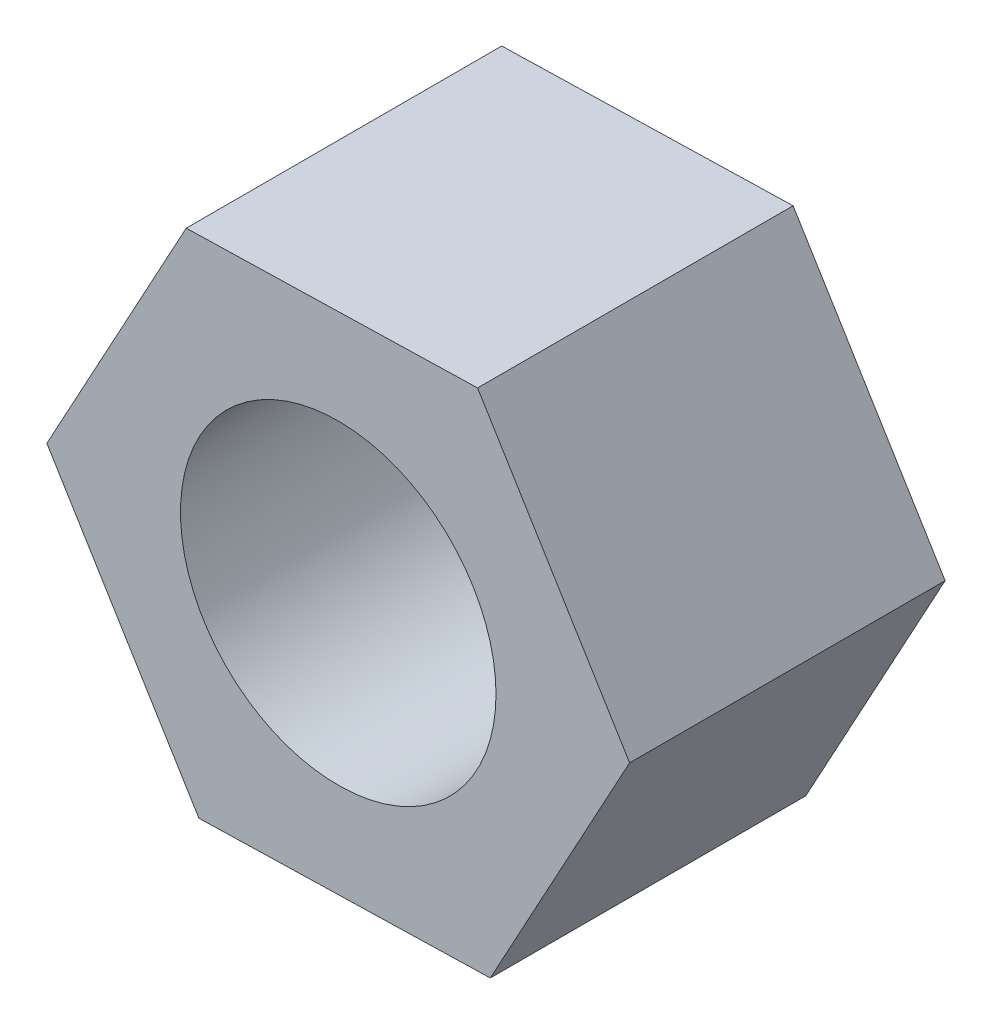
ISO-10303-21;
HEADER;
FILE_DESCRIPTION(('STEP AP214'),'2;1');
FILE_NAME('part.step','',(''),(''),'','','');
FILE_SCHEMA(('AUTOMOTIVE_DESIGN { 1 0 10303 214 1 1 1 1 }'));
ENDSEC;
DATA;
#1=APPLICATION_CONTEXT('core data for automotive mechanical design processes');
#2=APPLICATION_PROTOCOL_DEFINITION('international standard','automotive_design',2000,#1);
#3=PRODUCT_CONTEXT('',#1,'mechanical');
#4=PRODUCT('Part','Part','',(#3));
#5=PRODUCT_RELATED_PRODUCT_CATEGORY('part','',(#4));
#6=PRODUCT_DEFINITION_FORMATION('','',#4);
#7=PRODUCT_DEFINITION_CONTEXT('part definition',#1,'design');
#8=PRODUCT_DEFINITION('design','',#6,#7);
#9=PRODUCT_DEFINITION_SHAPE('','',#8);
#10=(LENGTH_UNIT() NAMED_UNIT(*) SI_UNIT(.MILLI.,.METRE.));
#11=(NAMED_UNIT(*) PLANE_ANGLE_UNIT() SI_UNIT($,.RADIAN.));
#12=(NAMED_UNIT(*) SI_UNIT($,.STERADIAN.) SOLID_ANGLE_UNIT());
#13=UNCERTAINTY_MEASURE_WITH_UNIT(LENGTH_MEASURE(1.E-05),#10,'distance_accuracy_value','');
#14=(GEOMETRIC_REPRESENTATION_CONTEXT(3) GLOBAL_UNCERTAINTY_ASSIGNED_CONTEXT((#13)) GLOBAL_UNIT_ASSIGNED_CONTEXT((#10,
#11,#12)) REPRESENTATION_CONTEXT('',''));
#15=CARTESIAN_POINT('',(0.,0.,0.));
#16=DIRECTION('',(0.,0.,1.));
#17=DIRECTION('',(1.,0.,0.));
#18=AXIS2_PLACEMENT_3D('',#15,#16,#17);
#19=CARTESIAN_POINT('',(4.61734472683495,0.116021579470562,5.));
#20=DIRECTION('',(-0.853192431880465,-0.521596275084378,0.));
#21=DIRECTION('',(0.521596275084378,-0.853192431880465,0.));
#22=AXIS2_PLACEMENT_3D('',#19,#20,#21);
#23=PLANE('',#22);
#24=DIRECTION('',(-0.521596275084378,0.853192431880465,0.));
#25=VECTOR('',#24,1.);
#26=CARTESIAN_POINT('',(4.61734472683495,0.116021579470562,0.));
#27=LINE('',#26,#25);
#28=CARTESIAN_POINT('',(4.61734472683495,0.116021579470562,0.));
#29=VERTEX_POINT('',#28);
#30=CARTESIAN_POINT('',(2.20819472820877,4.05674862120447,0.));
#31=VERTEX_POINT('',#30);
#32=EDGE_CURVE('E124',#29,#31,#27,.T.);
#33=ORIENTED_EDGE('',*,*,#32,.T.);
#34=DIRECTION('',(0.,0.,-1.));
#35=VECTOR('',#34,1.);
#36=CARTESIAN_POINT('',(2.20819472820877,4.05674862120447,5.));
#37=LINE('',#36,#35);
#38=CARTESIAN_POINT('',(2.20819472820877,4.05674862120447,5.));
#39=VERTEX_POINT('',#38);
#40=EDGE_CURVE('E11',#39,#31,#37,.T.);
#41=ORIENTED_EDGE('',*,*,#40,.F.);
#42=DIRECTION('',(-0.521596275084378,0.853192431880465,0.));
#43=VECTOR('',#42,1.);
#44=CARTESIAN_POINT('',(4.61734472683495,0.116021579470562,5.));
#45=LINE('',#44,#43);
#46=CARTESIAN_POINT('',(4.61734472683495,0.116021579470562,5.));
#47=VERTEX_POINT('',#46);
#48=EDGE_CURVE('E135',#47,#39,#45,.T.);
#49=ORIENTED_EDGE('',*,*,#48,.F.);
#50=DIRECTION('',(0.,0.,-1.));
#51=VECTOR('',#50,1.);
#52=CARTESIAN_POINT('',(4.61734472683495,0.116021579470562,5.));
#53=LINE('',#52,#51);
#54=EDGE_CURVE('E120',#47,#29,#53,.T.);
#55=ORIENTED_EDGE('',*,*,#54,.T.);
#56=EDGE_LOOP('',(#33,#41,#49,#55));
#57=FACE_BOUND('',#56,.T.);
#58=ADVANCED_FACE('F39',(#57),#23,.F.);
#59=CARTESIAN_POINT('',(2.20819472820877,4.05674862120447,5.));
#60=DIRECTION('',(0.0251194088021756,-0.999684457867296,0.));
#61=DIRECTION('',(0.999684457867296,0.0251194088021756,0.));
#62=AXIS2_PLACEMENT_3D('',#59,#60,#61);
#63=PLANE('',#62);
#64=DIRECTION('',(-0.999684457867296,-0.0251194088021756,0.));
#65=VECTOR('',#64,1.);
#66=CARTESIAN_POINT('',(2.20819472820877,4.05674862120447,0.));
#67=LINE('',#66,#65);
#68=CARTESIAN_POINT('',(-2.40914999862618,3.9407270417339,0.));
#69=VERTEX_POINT('',#68);
#70=EDGE_CURVE('E127',#31,#69,#67,.T.);
#71=ORIENTED_EDGE('',*,*,#70,.T.);
#72=DIRECTION('',(0.,0.,-1.));
#73=VECTOR('',#72,1.);
#74=CARTESIAN_POINT('',(-2.40914999862618,3.9407270417339,5.));
#75=LINE('',#74,#73);
#76=CARTESIAN_POINT('',(-2.40914999862618,3.9407270417339,5.));
#77=VERTEX_POINT('',#76);
#78=EDGE_CURVE('E48',#77,#69,#75,.T.);
#79=ORIENTED_EDGE('',*,*,#78,.F.);
#80=DIRECTION('',(-0.999684457867296,-0.0251194088021756,0.));
#81=VECTOR('',#80,1.);
#82=CARTESIAN_POINT('',(2.20819472820877,4.05674862120447,5.));
#83=LINE('',#82,#81);
#84=EDGE_CURVE('E93',#39,#77,#83,.T.);
#85=ORIENTED_EDGE('',*,*,#84,.F.);
#86=ORIENTED_EDGE('',*,*,#40,.T.);
#87=EDGE_LOOP('',(#71,#79,#85,#86));
#88=FACE_BOUND('',#87,.T.);
#89=ADVANCED_FACE('F161',(#88),#63,.F.);
#90=CARTESIAN_POINT('',(-2.40914999862618,3.9407270417339,5.));
#91=DIRECTION('',(0.87831184068264,-0.478088182782918,0.));
#92=DIRECTION('',(0.478088182782918,0.87831184068264,0.));
#93=AXIS2_PLACEMENT_3D('',#90,#91,#92);
#94=PLANE('',#93);
#95=DIRECTION('',(-0.478088182782918,-0.87831184068264,0.));
#96=VECTOR('',#95,1.);
#97=CARTESIAN_POINT('',(-2.40914999862618,3.9407270417339,0.));
#98=LINE('',#97,#96);
#99=CARTESIAN_POINT('',(-4.61734472683495,-0.116021579470562,0.));
#100=VERTEX_POINT('',#99);
#101=EDGE_CURVE('E130',#69,#100,#98,.T.);
#102=ORIENTED_EDGE('',*,*,#101,.T.);
#103=DIRECTION('',(0.,0.,-1.));
#104=VECTOR('',#103,1.);
#105=CARTESIAN_POINT('',(-4.61734472683495,-0.116021579470562,5.));
#106=LINE('',#105,#104);
#107=CARTESIAN_POINT('',(-4.61734472683495,-0.116021579470562,5.));
#108=VERTEX_POINT('',#107);
#109=EDGE_CURVE('E115',#108,#100,#106,.T.);
#110=ORIENTED_EDGE('',*,*,#109,.F.);
#111=DIRECTION('',(-0.478088182782918,-0.87831184068264,0.));
#112=VECTOR('',#111,1.);
#113=CARTESIAN_POINT('',(-2.40914999862618,3.9407270417339,5.));
#114=LINE('',#113,#112);
#115=EDGE_CURVE('E106',#77,#108,#114,.T.);
#116=ORIENTED_EDGE('',*,*,#115,.F.);
#117=ORIENTED_EDGE('',*,*,#78,.T.);
#118=EDGE_LOOP('',(#102,#110,#116,#117));
#119=FACE_BOUND('',#118,.T.);
#120=ADVANCED_FACE('F142',(#119),#94,.F.);
#121=CARTESIAN_POINT('',(-4.61734472683495,-0.116021579470562,5.));
#122=DIRECTION('',(0.853192431880465,0.521596275084379,0.));
#123=DIRECTION('',(-0.521596275084379,0.853192431880465,0.));
#124=AXIS2_PLACEMENT_3D('',#121,#122,#123);
#125=PLANE('',#124);
#126=DIRECTION('',(0.521596275084379,-0.853192431880464,0.));
#127=VECTOR('',#126,1.);
#128=CARTESIAN_POINT('',(-4.61734472683495,-0.116021579470562,0.));
#129=LINE('',#128,#127);
#130=CARTESIAN_POINT('',(-2.20819472820877,-4.05674862120446,0.));
#131=VERTEX_POINT('',#130);
#132=EDGE_CURVE('E114',#100,#131,#129,.T.);
#133=ORIENTED_EDGE('',*,*,#132,.T.);
#134=DIRECTION('',(0.,0.,-1.));
#135=VECTOR('',#134,1.);
#136=CARTESIAN_POINT('',(-2.20819472820877,-4.05674862120446,5.));
#137=LINE('',#136,#135);
#138=CARTESIAN_POINT('',(-2.20819472820877,-4.05674862120446,5.));
#139=VERTEX_POINT('',#138);
#140=EDGE_CURVE('E111',#139,#131,#137,.T.);
#141=ORIENTED_EDGE('',*,*,#140,.F.);
#142=DIRECTION('',(0.521596275084379,-0.853192431880464,0.));
#143=VECTOR('',#142,1.);
#144=CARTESIAN_POINT('',(-4.61734472683495,-0.116021579470562,5.));
#145=LINE('',#144,#143);
#146=EDGE_CURVE('E100',#108,#139,#145,.T.);
#147=ORIENTED_EDGE('',*,*,#146,.F.);
#148=ORIENTED_EDGE('',*,*,#109,.T.);
#149=EDGE_LOOP('',(#133,#141,#147,#148));
#150=FACE_BOUND('',#149,.T.);
#151=ADVANCED_FACE('F112',(#150),#125,.F.);
#152=CARTESIAN_POINT('',(-2.20819472820877,-4.05674862120446,5.));
#153=DIRECTION('',(-0.025119408802175,0.999684457867296,0.));
#154=DIRECTION('',(-0.999684457867296,-0.025119408802175,0.));
#155=AXIS2_PLACEMENT_3D('',#152,#153,#154);
#156=PLANE('',#155);
#157=DIRECTION('',(0.999684457867296,0.025119408802175,0.));
#158=VECTOR('',#157,1.);
#159=CARTESIAN_POINT('',(-2.20819472820877,-4.05674862120446,0.));
#160=LINE('',#159,#158);
#161=CARTESIAN_POINT('',(2.40914999862618,-3.9407270417339,0.));
#162=VERTEX_POINT('',#161);
#163=EDGE_CURVE('E79',#131,#162,#160,.T.);
#164=ORIENTED_EDGE('',*,*,#163,.T.);
#165=DIRECTION('',(0.,0.,-1.));
#166=VECTOR('',#165,1.);
#167=CARTESIAN_POINT('',(2.40914999862618,-3.9407270417339,5.));
#168=LINE('',#167,#166);
#169=CARTESIAN_POINT('',(2.40914999862618,-3.9407270417339,5.));
#170=VERTEX_POINT('',#169);
#171=EDGE_CURVE('E116',#170,#162,#168,.T.);
#172=ORIENTED_EDGE('',*,*,#171,.F.);
#173=DIRECTION('',(0.999684457867296,0.025119408802175,0.));
#174=VECTOR('',#173,1.);
#175=CARTESIAN_POINT('',(-2.20819472820877,-4.05674862120446,5.));
#176=LINE('',#175,#174);
#177=EDGE_CURVE('E104',#139,#170,#176,.T.);
#178=ORIENTED_EDGE('',*,*,#177,.F.);
#179=ORIENTED_EDGE('',*,*,#140,.T.);
#180=EDGE_LOOP('',(#164,#172,#178,#179));
#181=FACE_BOUND('',#180,.T.);
#182=ADVANCED_FACE('F118',(#181),#156,.F.);
#183=CARTESIAN_POINT('',(2.40914999862618,-3.9407270417339,5.));
#184=DIRECTION('',(-0.878311840682641,0.478088182782917,0.));
#185=DIRECTION('',(-0.478088182782917,-0.878311840682641,0.));
#186=AXIS2_PLACEMENT_3D('',#183,#184,#185);
#187=PLANE('',#186);
#188=DIRECTION('',(0.478088182782917,0.878311840682641,0.));
#189=VECTOR('',#188,1.);
#190=CARTESIAN_POINT('',(2.40914999862618,-3.9407270417339,0.));
#191=LINE('',#190,#189);
#192=EDGE_CURVE('E85',#162,#29,#191,.T.);
#193=ORIENTED_EDGE('',*,*,#192,.T.);
#194=ORIENTED_EDGE('',*,*,#54,.F.);
#195=DIRECTION('',(0.478088182782917,0.878311840682641,0.));
#196=VECTOR('',#195,1.);
#197=CARTESIAN_POINT('',(2.40914999862618,-3.9407270417339,5.));
#198=LINE('',#197,#196);
#199=EDGE_CURVE('E56',#170,#47,#198,.T.);
#200=ORIENTED_EDGE('',*,*,#199,.F.);
#201=ORIENTED_EDGE('',*,*,#171,.T.);
#202=EDGE_LOOP('',(#193,#194,#200,#201));
#203=FACE_BOUND('',#202,.T.);
#204=ADVANCED_FACE('F149',(#203),#187,.F.);
#205=CARTESIAN_POINT('',(0.,0.,5.));
#206=DIRECTION('',(0.,0.,1.));
#207=DIRECTION('',(1.,0.,0.));
#208=AXIS2_PLACEMENT_3D('',#205,#206,#207);
#209=PLANE('',#208);
#210=CARTESIAN_POINT('',(0.,0.,5.));
#211=DIRECTION('',(0.,0.,1.));
#212=DIRECTION('',(1.,0.,0.));
#213=AXIS2_PLACEMENT_3D('',#210,#211,#212);
#214=CIRCLE('',#213,2.5);
#215=CARTESIAN_POINT('',(2.5,0.,5.));
#216=VERTEX_POINT('',#215);
#217=EDGE_CURVE('E128',#216,#216,#214,.T.);
#218=ORIENTED_EDGE('',*,*,#217,.F.);
#219=EDGE_LOOP('',(#218));
#220=FACE_BOUND('',#219,.T.);
#221=ORIENTED_EDGE('',*,*,#48,.T.);
#222=ORIENTED_EDGE('',*,*,#84,.T.);
#223=ORIENTED_EDGE('',*,*,#115,.T.);
#224=ORIENTED_EDGE('',*,*,#146,.T.);
#225=ORIENTED_EDGE('',*,*,#177,.T.);
#226=ORIENTED_EDGE('',*,*,#199,.T.);
#227=EDGE_LOOP('',(#221,#222,#223,#224,#225,#226));
#228=FACE_BOUND('',#227,.T.);
#229=ADVANCED_FACE('F102',(#220,#228),#209,.T.);
#230=CARTESIAN_POINT('',(0.,0.,0.));
#231=DIRECTION('',(0.,0.,1.));
#232=DIRECTION('',(1.,0.,0.));
#233=AXIS2_PLACEMENT_3D('',#230,#231,#232);
#234=PLANE('',#233);
#235=CARTESIAN_POINT('',(0.,0.,0.));
#236=DIRECTION('',(0.,0.,1.));
#237=DIRECTION('',(1.,0.,0.));
#238=AXIS2_PLACEMENT_3D('',#235,#236,#237);
#239=CIRCLE('',#238,2.5);
#240=CARTESIAN_POINT('',(2.5,0.,0.));
#241=VERTEX_POINT('',#240);
#242=EDGE_CURVE('E42',#241,#241,#239,.T.);
#243=ORIENTED_EDGE('',*,*,#242,.T.);
#244=EDGE_LOOP('',(#243));
#245=FACE_BOUND('',#244,.T.);
#246=ORIENTED_EDGE('',*,*,#32,.F.);
#247=ORIENTED_EDGE('',*,*,#192,.F.);
#248=ORIENTED_EDGE('',*,*,#163,.F.);
#249=ORIENTED_EDGE('',*,*,#132,.F.);
#250=ORIENTED_EDGE('',*,*,#101,.F.);
#251=ORIENTED_EDGE('',*,*,#70,.F.);
#252=EDGE_LOOP('',(#246,#247,#248,#249,#250,#251));
#253=FACE_BOUND('',#252,.T.);
#254=ADVANCED_FACE('F145',(#245,#253),#234,.F.);
#255=CARTESIAN_POINT('',(0.,0.,-4.));
#256=DIRECTION('',(0.,0.,1.));
#257=DIRECTION('',(1.,0.,0.));
#258=AXIS2_PLACEMENT_3D('',#255,#256,#257);
#259=CYLINDRICAL_SURFACE('',#258,2.5);
#260=ORIENTED_EDGE('',*,*,#217,.T.);
#261=EDGE_LOOP('',(#260));
#262=FACE_BOUND('',#261,.T.);
#263=ORIENTED_EDGE('',*,*,#242,.F.);
#264=EDGE_LOOP('',(#263));
#265=FACE_BOUND('',#264,.T.);
#266=ADVANCED_FACE('F200',(#262,#265),#259,.F.);
#267=CLOSED_SHELL('',(#58,#89,#120,#151,#182,#204,#229,#254,#266));
#268=MANIFOLD_SOLID_BREP('B2',#267);
#269=ADVANCED_BREP_SHAPE_REPRESENTATION('',(#18,#268),#14);
#270=SHAPE_DEFINITION_REPRESENTATION(#9,#269);
ENDSEC;
END-ISO-10303-21;
